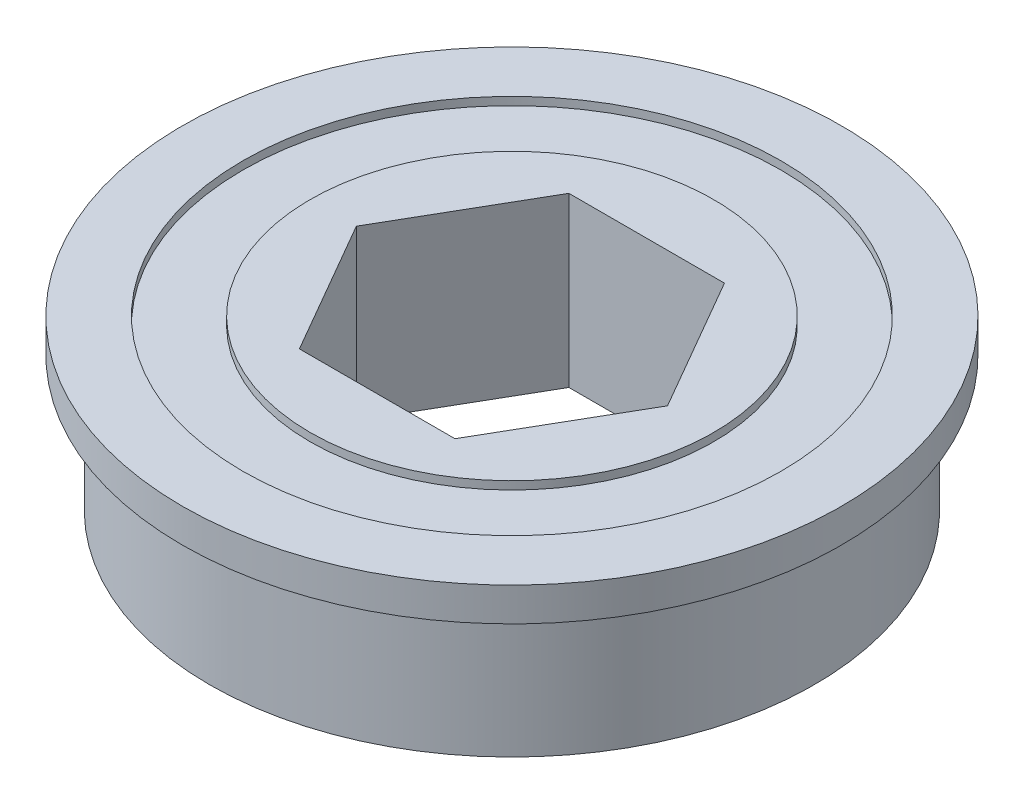
ISO-10303-21;
HEADER;
FILE_DESCRIPTION(('STEP AP214'),'2;1');
FILE_NAME('part.step','',(''),(''),'','','');
FILE_SCHEMA(('AUTOMOTIVE_DESIGN { 1 0 10303 214 1 1 1 1 }'));
ENDSEC;
DATA;
#1=APPLICATION_CONTEXT('core data for automotive mechanical design processes');
#2=APPLICATION_PROTOCOL_DEFINITION('international standard','automotive_design',2000,#1);
#3=PRODUCT_CONTEXT('',#1,'mechanical');
#4=PRODUCT('Part','Part','',(#3));
#5=PRODUCT_RELATED_PRODUCT_CATEGORY('part','',(#4));
#6=PRODUCT_DEFINITION_FORMATION('','',#4);
#7=PRODUCT_DEFINITION_CONTEXT('part definition',#1,'design');
#8=PRODUCT_DEFINITION('design','',#6,#7);
#9=PRODUCT_DEFINITION_SHAPE('','',#8);
#10=(LENGTH_UNIT() NAMED_UNIT(*) SI_UNIT(.MILLI.,.METRE.));
#11=(NAMED_UNIT(*) PLANE_ANGLE_UNIT() SI_UNIT($,.RADIAN.));
#12=(NAMED_UNIT(*) SI_UNIT($,.STERADIAN.) SOLID_ANGLE_UNIT());
#13=UNCERTAINTY_MEASURE_WITH_UNIT(LENGTH_MEASURE(1.E-05),#10,'distance_accuracy_value','');
#14=(GEOMETRIC_REPRESENTATION_CONTEXT(3) GLOBAL_UNCERTAINTY_ASSIGNED_CONTEXT((#13)) GLOBAL_UNIT_ASSIGNED_CONTEXT((#10,
#11,#12)) REPRESENTATION_CONTEXT('',''));
#15=CARTESIAN_POINT('',(0.,0.,0.));
#16=DIRECTION('',(0.,0.,1.));
#17=DIRECTION('',(1.,0.,0.));
#18=AXIS2_PLACEMENT_3D('',#15,#16,#17);
#19=CARTESIAN_POINT('',(14.2748,0.,0.));
#20=DIRECTION('',(0.,-1.,0.));
#21=DIRECTION('',(0.,0.,-1.));
#22=AXIS2_PLACEMENT_3D('',#19,#20,#21);
#23=PLANE('',#22);
#24=DIRECTION('',(1.,0.,0.));
#25=VECTOR('',#24,1.);
#26=CARTESIAN_POINT('',(14.2748,0.,6.36));
#27=LINE('',#26,#25);
#28=CARTESIAN_POINT('',(-3.67194771204601,0.,6.36));
#29=VERTEX_POINT('',#28);
#30=CARTESIAN_POINT('',(3.67194771204602,0.,6.36));
#31=VERTEX_POINT('',#30);
#32=EDGE_CURVE('E157',#29,#31,#27,.T.);
#33=ORIENTED_EDGE('',*,*,#32,.T.);
#34=DIRECTION('',(0.5,0.,-0.866025403784439));
#35=VECTOR('',#34,1.);
#36=CARTESIAN_POINT('',(3.67194771204602,0.,6.36));
#37=LINE('',#36,#35);
#38=CARTESIAN_POINT('',(7.34389542409204,0.,0.));
#39=VERTEX_POINT('',#38);
#40=EDGE_CURVE('E50',#31,#39,#37,.T.);
#41=ORIENTED_EDGE('',*,*,#40,.T.);
#42=DIRECTION('',(-0.5,0.,-0.866025403784438));
#43=VECTOR('',#42,1.);
#44=CARTESIAN_POINT('',(7.34389542409204,0.,0.));
#45=LINE('',#44,#43);
#46=CARTESIAN_POINT('',(3.67194771204602,0.,-6.36));
#47=VERTEX_POINT('',#46);
#48=EDGE_CURVE('E123',#39,#47,#45,.T.);
#49=ORIENTED_EDGE('',*,*,#48,.T.);
#50=DIRECTION('',(1.,0.,0.));
#51=VECTOR('',#50,1.);
#52=CARTESIAN_POINT('',(14.2748,0.,-6.36));
#53=LINE('',#52,#51);
#54=CARTESIAN_POINT('',(-3.67194771204602,0.,-6.36));
#55=VERTEX_POINT('',#54);
#56=EDGE_CURVE('E115',#47,#55,#53,.F.);
#57=ORIENTED_EDGE('',*,*,#56,.T.);
#58=DIRECTION('',(-0.5,0.,0.866025403784439));
#59=VECTOR('',#58,1.);
#60=CARTESIAN_POINT('',(-3.67194771204602,0.,-6.36));
#61=LINE('',#60,#59);
#62=CARTESIAN_POINT('',(-7.34389542409204,0.,0.));
#63=VERTEX_POINT('',#62);
#64=EDGE_CURVE('E163',#55,#63,#61,.T.);
#65=ORIENTED_EDGE('',*,*,#64,.T.);
#66=DIRECTION('',(0.5,0.,0.866025403784439));
#67=VECTOR('',#66,1.);
#68=CARTESIAN_POINT('',(-7.34389542409204,0.,0.));
#69=LINE('',#68,#67);
#70=EDGE_CURVE('E160',#63,#29,#69,.T.);
#71=ORIENTED_EDGE('',*,*,#70,.T.);
#72=EDGE_LOOP('',(#33,#41,#49,#57,#65,#71));
#73=FACE_BOUND('',#72,.T.);
#74=CARTESIAN_POINT('',(0.,0.,0.));
#75=DIRECTION('',(0.,-1.,0.));
#76=DIRECTION('',(0.,0.,-1.));
#77=AXIS2_PLACEMENT_3D('',#74,#75,#76);
#78=CIRCLE('',#77,9.525);
#79=CARTESIAN_POINT('',(0.,0.,-9.525));
#80=VERTEX_POINT('',#79);
#81=EDGE_CURVE('E152',#80,#80,#78,.T.);
#82=ORIENTED_EDGE('',*,*,#81,.T.);
#83=EDGE_LOOP('',(#82));
#84=FACE_BOUND('',#83,.T.);
#85=ADVANCED_FACE('F40',(#73,#84),#23,.T.);
#86=CARTESIAN_POINT('',(0.,0.,0.));
#87=DIRECTION('',(0.,1.,0.));
#88=DIRECTION('',(0.,0.,1.));
#89=AXIS2_PLACEMENT_3D('',#86,#87,#88);
#90=CYLINDRICAL_SURFACE('',#89,12.7);
#91=CARTESIAN_POINT('',(0.,7.9375,0.));
#92=DIRECTION('',(0.,1.,0.));
#93=DIRECTION('',(0.,0.,1.));
#94=AXIS2_PLACEMENT_3D('',#91,#92,#93);
#95=CIRCLE('',#94,12.7);
#96=CARTESIAN_POINT('',(0.,7.9375,12.7));
#97=VERTEX_POINT('',#96);
#98=EDGE_CURVE('E135',#97,#97,#95,.F.);
#99=ORIENTED_EDGE('',*,*,#98,.F.);
#100=EDGE_LOOP('',(#99));
#101=FACE_BOUND('',#100,.T.);
#102=CARTESIAN_POINT('',(0.,7.5565,0.));
#103=DIRECTION('',(0.,1.,0.));
#104=DIRECTION('',(0.,0.,1.));
#105=AXIS2_PLACEMENT_3D('',#102,#103,#104);
#106=CIRCLE('',#105,12.7);
#107=CARTESIAN_POINT('',(0.,7.5565,12.7));
#108=VERTEX_POINT('',#107);
#109=EDGE_CURVE('E44',#108,#108,#106,.T.);
#110=ORIENTED_EDGE('',*,*,#109,.F.);
#111=EDGE_LOOP('',(#110));
#112=FACE_BOUND('',#111,.T.);
#113=ADVANCED_FACE('F42',(#101,#112),#90,.F.);
#114=CARTESIAN_POINT('',(9.525,7.5565,0.));
#115=DIRECTION('',(0.,1.,0.));
#116=DIRECTION('',(0.,0.,1.));
#117=AXIS2_PLACEMENT_3D('',#114,#115,#116);
#118=PLANE('',#117);
#119=CARTESIAN_POINT('',(0.,7.5565,0.));
#120=DIRECTION('',(0.,1.,0.));
#121=DIRECTION('',(0.,0.,1.));
#122=AXIS2_PLACEMENT_3D('',#119,#120,#121);
#123=CIRCLE('',#122,9.525);
#124=CARTESIAN_POINT('',(0.,7.5565,9.525));
#125=VERTEX_POINT('',#124);
#126=EDGE_CURVE('E133',#125,#125,#123,.T.);
#127=ORIENTED_EDGE('',*,*,#126,.F.);
#128=EDGE_LOOP('',(#127));
#129=FACE_BOUND('',#128,.T.);
#130=ORIENTED_EDGE('',*,*,#109,.T.);
#131=EDGE_LOOP('',(#130));
#132=FACE_BOUND('',#131,.T.);
#133=ADVANCED_FACE('F207',(#129,#132),#118,.T.);
#134=CARTESIAN_POINT('',(12.7,7.9375,0.));
#135=DIRECTION('',(0.,1.,0.));
#136=DIRECTION('',(0.,0.,1.));
#137=AXIS2_PLACEMENT_3D('',#134,#135,#136);
#138=PLANE('',#137);
#139=ORIENTED_EDGE('',*,*,#98,.T.);
#140=EDGE_LOOP('',(#139));
#141=FACE_BOUND('',#140,.T.);
#142=CARTESIAN_POINT('',(0.,7.9375,0.));
#143=DIRECTION('',(0.,1.,0.));
#144=DIRECTION('',(0.,0.,1.));
#145=AXIS2_PLACEMENT_3D('',#142,#143,#144);
#146=CIRCLE('',#145,15.5575);
#147=CARTESIAN_POINT('',(0.,7.9375,15.5575));
#148=VERTEX_POINT('',#147);
#149=EDGE_CURVE('E130',#148,#148,#146,.F.);
#150=ORIENTED_EDGE('',*,*,#149,.F.);
#151=EDGE_LOOP('',(#150));
#152=FACE_BOUND('',#151,.T.);
#153=ADVANCED_FACE('F248',(#141,#152),#138,.T.);
#154=CARTESIAN_POINT('',(0.,0.,0.));
#155=DIRECTION('',(0.,1.,0.));
#156=DIRECTION('',(0.,0.,1.));
#157=AXIS2_PLACEMENT_3D('',#154,#155,#156);
#158=CYLINDRICAL_SURFACE('',#157,9.525);
#159=ORIENTED_EDGE('',*,*,#126,.T.);
#160=EDGE_LOOP('',(#159));
#161=FACE_BOUND('',#160,.T.);
#162=CARTESIAN_POINT('',(0.,7.9375,0.));
#163=DIRECTION('',(0.,1.,0.));
#164=DIRECTION('',(0.,0.,1.));
#165=AXIS2_PLACEMENT_3D('',#162,#163,#164);
#166=CIRCLE('',#165,9.525);
#167=CARTESIAN_POINT('',(0.,7.9375,9.525));
#168=VERTEX_POINT('',#167);
#169=EDGE_CURVE('E127',#168,#168,#166,.T.);
#170=ORIENTED_EDGE('',*,*,#169,.F.);
#171=EDGE_LOOP('',(#170));
#172=FACE_BOUND('',#171,.T.);
#173=ADVANCED_FACE('F244',(#161,#172),#158,.T.);
#174=CARTESIAN_POINT('',(0.,0.,0.));
#175=DIRECTION('',(0.,1.,0.));
#176=DIRECTION('',(0.,0.,1.));
#177=AXIS2_PLACEMENT_3D('',#174,#175,#176);
#178=CYLINDRICAL_SURFACE('',#177,15.5575);
#179=CARTESIAN_POINT('',(0.,6.35,0.));
#180=DIRECTION('',(0.,1.,0.));
#181=DIRECTION('',(0.,0.,1.));
#182=AXIS2_PLACEMENT_3D('',#179,#180,#181);
#183=CIRCLE('',#182,15.5575);
#184=CARTESIAN_POINT('',(0.,6.35,15.5575));
#185=VERTEX_POINT('',#184);
#186=EDGE_CURVE('E105',#185,#185,#183,.F.);
#187=ORIENTED_EDGE('',*,*,#186,.F.);
#188=EDGE_LOOP('',(#187));
#189=FACE_BOUND('',#188,.T.);
#190=ORIENTED_EDGE('',*,*,#149,.T.);
#191=EDGE_LOOP('',(#190));
#192=FACE_BOUND('',#191,.T.);
#193=ADVANCED_FACE('F237',(#189,#192),#178,.T.);
#194=CARTESIAN_POINT('',(6.35,7.9375,0.));
#195=DIRECTION('',(0.,1.,0.));
#196=DIRECTION('',(0.,0.,1.));
#197=AXIS2_PLACEMENT_3D('',#194,#195,#196);
#198=PLANE('',#197);
#199=ORIENTED_EDGE('',*,*,#169,.T.);
#200=EDGE_LOOP('',(#199));
#201=FACE_BOUND('',#200,.T.);
#202=DIRECTION('',(-0.5,0.,0.866025403784439));
#203=VECTOR('',#202,1.);
#204=CARTESIAN_POINT('',(-3.67194771204602,7.9375,-6.36));
#205=LINE('',#204,#203);
#206=CARTESIAN_POINT('',(-7.34389542409204,7.9375,0.));
#207=VERTEX_POINT('',#206);
#208=CARTESIAN_POINT('',(-3.67194771204602,7.9375,-6.36));
#209=VERTEX_POINT('',#208);
#210=EDGE_CURVE('E109',#207,#209,#205,.F.);
#211=ORIENTED_EDGE('',*,*,#210,.T.);
#212=DIRECTION('',(-1.,0.,0.));
#213=VECTOR('',#212,1.);
#214=CARTESIAN_POINT('',(3.67194771204602,7.9375,-6.36));
#215=LINE('',#214,#213);
#216=CARTESIAN_POINT('',(3.67194771204602,7.9375,-6.36));
#217=VERTEX_POINT('',#216);
#218=EDGE_CURVE('E91',#209,#217,#215,.F.);
#219=ORIENTED_EDGE('',*,*,#218,.T.);
#220=DIRECTION('',(-0.5,0.,-0.866025403784439));
#221=VECTOR('',#220,1.);
#222=CARTESIAN_POINT('',(7.34389542409204,7.9375,0.));
#223=LINE('',#222,#221);
#224=CARTESIAN_POINT('',(7.34389542409204,7.9375,0.));
#225=VERTEX_POINT('',#224);
#226=EDGE_CURVE('E96',#217,#225,#223,.F.);
#227=ORIENTED_EDGE('',*,*,#226,.T.);
#228=DIRECTION('',(0.5,0.,-0.866025403784439));
#229=VECTOR('',#228,1.);
#230=CARTESIAN_POINT('',(3.67194771204602,7.9375,6.36));
#231=LINE('',#230,#229);
#232=CARTESIAN_POINT('',(3.67194771204602,7.9375,6.36));
#233=VERTEX_POINT('',#232);
#234=EDGE_CURVE('E124',#225,#233,#231,.F.);
#235=ORIENTED_EDGE('',*,*,#234,.T.);
#236=DIRECTION('',(1.,0.,0.));
#237=VECTOR('',#236,1.);
#238=CARTESIAN_POINT('',(-3.67194771204601,7.9375,6.36));
#239=LINE('',#238,#237);
#240=CARTESIAN_POINT('',(-3.67194771204601,7.9375,6.36));
#241=VERTEX_POINT('',#240);
#242=EDGE_CURVE('E171',#233,#241,#239,.F.);
#243=ORIENTED_EDGE('',*,*,#242,.T.);
#244=DIRECTION('',(0.5,0.,0.866025403784439));
#245=VECTOR('',#244,1.);
#246=CARTESIAN_POINT('',(-7.34389542409204,7.9375,0.));
#247=LINE('',#246,#245);
#248=EDGE_CURVE('E176',#241,#207,#247,.F.);
#249=ORIENTED_EDGE('',*,*,#248,.T.);
#250=EDGE_LOOP('',(#211,#219,#227,#235,#243,#249));
#251=FACE_BOUND('',#250,.T.);
#252=ADVANCED_FACE('F107',(#201,#251),#198,.T.);
#253=CARTESIAN_POINT('',(15.5575,6.35,0.));
#254=DIRECTION('',(0.,-1.,0.));
#255=DIRECTION('',(0.,0.,-1.));
#256=AXIS2_PLACEMENT_3D('',#253,#254,#255);
#257=PLANE('',#256);
#258=ORIENTED_EDGE('',*,*,#186,.T.);
#259=EDGE_LOOP('',(#258));
#260=FACE_BOUND('',#259,.T.);
#261=CARTESIAN_POINT('',(0.,6.35,0.));
#262=DIRECTION('',(0.,1.,0.));
#263=DIRECTION('',(0.,0.,1.));
#264=AXIS2_PLACEMENT_3D('',#261,#262,#263);
#265=CIRCLE('',#264,14.2748);
#266=CARTESIAN_POINT('',(0.,6.35,14.2748));
#267=VERTEX_POINT('',#266);
#268=EDGE_CURVE('E120',#267,#267,#265,.F.);
#269=ORIENTED_EDGE('',*,*,#268,.F.);
#270=EDGE_LOOP('',(#269));
#271=FACE_BOUND('',#270,.T.);
#272=ADVANCED_FACE('F228',(#260,#271),#257,.T.);
#273=CARTESIAN_POINT('',(7.34389542409204,0.,0.));
#274=DIRECTION('',(0.866025403784439,0.,-0.5));
#275=DIRECTION('',(-0.5,0.,-0.866025403784439));
#276=AXIS2_PLACEMENT_3D('',#273,#274,#275);
#277=PLANE('',#276);
#278=DIRECTION('',(0.,1.,0.));
#279=VECTOR('',#278,1.);
#280=CARTESIAN_POINT('',(3.67194771204602,0.,-6.36));
#281=LINE('',#280,#279);
#282=EDGE_CURVE('E98',#217,#47,#281,.F.);
#283=ORIENTED_EDGE('',*,*,#282,.T.);
#284=ORIENTED_EDGE('',*,*,#48,.F.);
#285=DIRECTION('',(0.,1.,0.));
#286=VECTOR('',#285,1.);
#287=CARTESIAN_POINT('',(7.34389542409204,0.,0.));
#288=LINE('',#287,#286);
#289=EDGE_CURVE('E101',#39,#225,#288,.T.);
#290=ORIENTED_EDGE('',*,*,#289,.T.);
#291=ORIENTED_EDGE('',*,*,#226,.F.);
#292=EDGE_LOOP('',(#283,#284,#290,#291));
#293=FACE_BOUND('',#292,.T.);
#294=ADVANCED_FACE('F97',(#293),#277,.F.);
#295=CARTESIAN_POINT('',(3.67194771204602,0.,-6.36));
#296=DIRECTION('',(0.,0.,-1.));
#297=DIRECTION('',(-1.,0.,0.));
#298=AXIS2_PLACEMENT_3D('',#295,#296,#297);
#299=PLANE('',#298);
#300=DIRECTION('',(0.,1.,0.));
#301=VECTOR('',#300,1.);
#302=CARTESIAN_POINT('',(-3.67194771204602,0.,-6.36));
#303=LINE('',#302,#301);
#304=EDGE_CURVE('E111',#209,#55,#303,.F.);
#305=ORIENTED_EDGE('',*,*,#304,.T.);
#306=ORIENTED_EDGE('',*,*,#56,.F.);
#307=ORIENTED_EDGE('',*,*,#282,.F.);
#308=ORIENTED_EDGE('',*,*,#218,.F.);
#309=EDGE_LOOP('',(#305,#306,#307,#308));
#310=FACE_BOUND('',#309,.T.);
#311=ADVANCED_FACE('F113',(#310),#299,.F.);
#312=CARTESIAN_POINT('',(-3.67194771204602,0.,-6.36));
#313=DIRECTION('',(-0.866025403784439,0.,-0.5));
#314=DIRECTION('',(-0.5,0.,0.866025403784439));
#315=AXIS2_PLACEMENT_3D('',#312,#313,#314);
#316=PLANE('',#315);
#317=DIRECTION('',(0.,1.,0.));
#318=VECTOR('',#317,1.);
#319=CARTESIAN_POINT('',(-7.34389542409204,0.,0.));
#320=LINE('',#319,#318);
#321=EDGE_CURVE('E178',#207,#63,#320,.F.);
#322=ORIENTED_EDGE('',*,*,#321,.T.);
#323=ORIENTED_EDGE('',*,*,#64,.F.);
#324=ORIENTED_EDGE('',*,*,#304,.F.);
#325=ORIENTED_EDGE('',*,*,#210,.F.);
#326=EDGE_LOOP('',(#322,#323,#324,#325));
#327=FACE_BOUND('',#326,.T.);
#328=ADVANCED_FACE('F182',(#327),#316,.F.);
#329=CARTESIAN_POINT('',(-7.34389542409204,0.,0.));
#330=DIRECTION('',(-0.866025403784439,0.,0.5));
#331=DIRECTION('',(0.5,0.,0.866025403784439));
#332=AXIS2_PLACEMENT_3D('',#329,#330,#331);
#333=PLANE('',#332);
#334=DIRECTION('',(0.,1.,0.));
#335=VECTOR('',#334,1.);
#336=CARTESIAN_POINT('',(-3.67194771204601,0.,6.36));
#337=LINE('',#336,#335);
#338=EDGE_CURVE('E174',#241,#29,#337,.F.);
#339=ORIENTED_EDGE('',*,*,#338,.T.);
#340=ORIENTED_EDGE('',*,*,#70,.F.);
#341=ORIENTED_EDGE('',*,*,#321,.F.);
#342=ORIENTED_EDGE('',*,*,#248,.F.);
#343=EDGE_LOOP('',(#339,#340,#341,#342));
#344=FACE_BOUND('',#343,.T.);
#345=ADVANCED_FACE('F192',(#344),#333,.F.);
#346=CARTESIAN_POINT('',(-3.67194771204601,0.,6.36));
#347=DIRECTION('',(0.,0.,1.));
#348=DIRECTION('',(1.,0.,0.));
#349=AXIS2_PLACEMENT_3D('',#346,#347,#348);
#350=PLANE('',#349);
#351=DIRECTION('',(0.,1.,0.));
#352=VECTOR('',#351,1.);
#353=CARTESIAN_POINT('',(3.67194771204602,0.,6.36));
#354=LINE('',#353,#352);
#355=EDGE_CURVE('E59',#233,#31,#354,.F.);
#356=ORIENTED_EDGE('',*,*,#355,.T.);
#357=ORIENTED_EDGE('',*,*,#32,.F.);
#358=ORIENTED_EDGE('',*,*,#338,.F.);
#359=ORIENTED_EDGE('',*,*,#242,.F.);
#360=EDGE_LOOP('',(#356,#357,#358,#359));
#361=FACE_BOUND('',#360,.T.);
#362=ADVANCED_FACE('F190',(#361),#350,.F.);
#363=CARTESIAN_POINT('',(3.67194771204602,0.,6.36));
#364=DIRECTION('',(0.866025403784439,0.,0.5));
#365=DIRECTION('',(0.5,0.,-0.866025403784439));
#366=AXIS2_PLACEMENT_3D('',#363,#364,#365);
#367=PLANE('',#366);
#368=ORIENTED_EDGE('',*,*,#289,.F.);
#369=ORIENTED_EDGE('',*,*,#40,.F.);
#370=ORIENTED_EDGE('',*,*,#355,.F.);
#371=ORIENTED_EDGE('',*,*,#234,.F.);
#372=EDGE_LOOP('',(#368,#369,#370,#371));
#373=FACE_BOUND('',#372,.T.);
#374=ADVANCED_FACE('F188',(#373),#367,.F.);
#375=CARTESIAN_POINT('',(0.,0.,0.));
#376=DIRECTION('',(0.,1.,0.));
#377=DIRECTION('',(0.,0.,1.));
#378=AXIS2_PLACEMENT_3D('',#375,#376,#377);
#379=CYLINDRICAL_SURFACE('',#378,14.2748);
#380=CARTESIAN_POINT('',(0.,0.,0.));
#381=DIRECTION('',(0.,1.,0.));
#382=DIRECTION('',(0.,0.,1.));
#383=AXIS2_PLACEMENT_3D('',#380,#381,#382);
#384=CIRCLE('',#383,14.2748);
#385=CARTESIAN_POINT('',(0.,0.,14.2748));
#386=VERTEX_POINT('',#385);
#387=EDGE_CURVE('E11',#386,#386,#384,.F.);
#388=ORIENTED_EDGE('',*,*,#387,.F.);
#389=EDGE_LOOP('',(#388));
#390=FACE_BOUND('',#389,.T.);
#391=ORIENTED_EDGE('',*,*,#268,.T.);
#392=EDGE_LOOP('',(#391));
#393=FACE_BOUND('',#392,.T.);
#394=ADVANCED_FACE('F213',(#390,#393),#379,.T.);
#395=CARTESIAN_POINT('',(0.,0.,0.));
#396=DIRECTION('',(0.,-1.,0.));
#397=DIRECTION('',(0.,0.,-1.));
#398=AXIS2_PLACEMENT_3D('',#395,#396,#397);
#399=CIRCLE('',#398,12.7);
#400=CARTESIAN_POINT('',(0.,0.,-12.7));
#401=VERTEX_POINT('',#400);
#402=EDGE_CURVE('E144',#401,#401,#399,.T.);
#403=ORIENTED_EDGE('',*,*,#402,.F.);
#404=EDGE_LOOP('',(#403));
#405=FACE_BOUND('',#404,.T.);
#406=ORIENTED_EDGE('',*,*,#387,.T.);
#407=EDGE_LOOP('',(#406));
#408=FACE_BOUND('',#407,.T.);
#409=ADVANCED_FACE('F203',(#405,#408),#23,.T.);
#410=CARTESIAN_POINT('',(0.,0.381,0.));
#411=DIRECTION('',(0.,-1.,0.));
#412=DIRECTION('',(0.,0.,-1.));
#413=AXIS2_PLACEMENT_3D('',#410,#411,#412);
#414=CYLINDRICAL_SURFACE('',#413,12.7);
#415=CARTESIAN_POINT('',(0.,0.381,0.));
#416=DIRECTION('',(0.,-1.,0.));
#417=DIRECTION('',(0.,0.,-1.));
#418=AXIS2_PLACEMENT_3D('',#415,#416,#417);
#419=CIRCLE('',#418,12.7);
#420=CARTESIAN_POINT('',(0.,0.381,-12.7));
#421=VERTEX_POINT('',#420);
#422=EDGE_CURVE('E140',#421,#421,#419,.T.);
#423=CARTESIAN_POINT('',(0.,0.381,-12.7));
#424=CARTESIAN_POINT('',(0.,0.37703125,-12.7));
#425=CARTESIAN_POINT('',(0.,0.3730625,-12.7));
#426=CARTESIAN_POINT('',(0.,0.365125,-12.7));
#427=CARTESIAN_POINT('',(0.,0.36115625,-12.7));
#428=CARTESIAN_POINT('',(0.,0.35321875,-12.7));
#429=CARTESIAN_POINT('',(0.,0.34925,-12.7));
#430=CARTESIAN_POINT('',(0.,0.3413125,-12.7));
#431=CARTESIAN_POINT('',(0.,0.33734375,-12.7));
#432=CARTESIAN_POINT('',(0.,0.32940625,-12.7));
#433=CARTESIAN_POINT('',(0.,0.3254375,-12.7));
#434=CARTESIAN_POINT('',(0.,0.3175,-12.7));
#435=CARTESIAN_POINT('',(0.,0.31353125,-12.7));
#436=CARTESIAN_POINT('',(0.,0.30559375,-12.7));
#437=CARTESIAN_POINT('',(0.,0.301625,-12.7));
#438=CARTESIAN_POINT('',(0.,0.2936875,-12.7));
#439=CARTESIAN_POINT('',(0.,0.28971875,-12.7));
#440=CARTESIAN_POINT('',(0.,0.28178125,-12.7));
#441=CARTESIAN_POINT('',(0.,0.2778125,-12.7));
#442=CARTESIAN_POINT('',(0.,0.269875,-12.7));
#443=CARTESIAN_POINT('',(0.,0.26590625,-12.7));
#444=CARTESIAN_POINT('',(0.,0.25796875,-12.7));
#445=CARTESIAN_POINT('',(0.,0.254,-12.7));
#446=CARTESIAN_POINT('',(0.,0.2460625,-12.7));
#447=CARTESIAN_POINT('',(0.,0.24209375,-12.7));
#448=CARTESIAN_POINT('',(0.,0.23415625,-12.7));
#449=CARTESIAN_POINT('',(0.,0.2301875,-12.7));
#450=CARTESIAN_POINT('',(0.,0.22225,-12.7));
#451=CARTESIAN_POINT('',(0.,0.21828125,-12.7));
#452=CARTESIAN_POINT('',(0.,0.21034375,-12.7));
#453=CARTESIAN_POINT('',(0.,0.206375,-12.7));
#454=CARTESIAN_POINT('',(0.,0.1984375,-12.7));
#455=CARTESIAN_POINT('',(0.,0.19446875,-12.7));
#456=CARTESIAN_POINT('',(0.,0.18653125,-12.7));
#457=CARTESIAN_POINT('',(0.,0.1825625,-12.7));
#458=CARTESIAN_POINT('',(0.,0.174625,-12.7));
#459=CARTESIAN_POINT('',(0.,0.17065625,-12.7));
#460=CARTESIAN_POINT('',(0.,0.16271875,-12.7));
#461=CARTESIAN_POINT('',(0.,0.15875,-12.7));
#462=CARTESIAN_POINT('',(0.,0.1508125,-12.7));
#463=CARTESIAN_POINT('',(0.,0.14684375,-12.7));
#464=CARTESIAN_POINT('',(0.,0.13890625,-12.7));
#465=CARTESIAN_POINT('',(0.,0.1349375,-12.7));
#466=CARTESIAN_POINT('',(0.,0.127,-12.7));
#467=CARTESIAN_POINT('',(0.,0.12303125,-12.7));
#468=CARTESIAN_POINT('',(0.,0.11509375,-12.7));
#469=CARTESIAN_POINT('',(0.,0.111125,-12.7));
#470=CARTESIAN_POINT('',(0.,0.1031875,-12.7));
#471=CARTESIAN_POINT('',(0.,0.09921875,-12.7));
#472=CARTESIAN_POINT('',(0.,0.09128125,-12.7));
#473=CARTESIAN_POINT('',(0.,0.0873125,-12.7));
#474=CARTESIAN_POINT('',(0.,0.079375,-12.7));
#475=CARTESIAN_POINT('',(0.,0.07540625,-12.7));
#476=CARTESIAN_POINT('',(0.,0.06746875,-12.7));
#477=CARTESIAN_POINT('',(0.,0.0635,-12.7));
#478=CARTESIAN_POINT('',(0.,0.0555625,-12.7));
#479=CARTESIAN_POINT('',(0.,0.05159375,-12.7));
#480=CARTESIAN_POINT('',(0.,0.04365625,-12.7));
#481=CARTESIAN_POINT('',(0.,0.0396875,-12.7));
#482=CARTESIAN_POINT('',(0.,0.03175,-12.7));
#483=CARTESIAN_POINT('',(0.,0.02778125,-12.7));
#484=CARTESIAN_POINT('',(0.,0.01984375,-12.7));
#485=CARTESIAN_POINT('',(0.,0.015875,-12.7));
#486=CARTESIAN_POINT('',(0.,0.00793749999999999,-12.7));
#487=CARTESIAN_POINT('',(0.,0.00396874999999999,-12.7));
#488=CARTESIAN_POINT('',(0.,0.,-12.7));
#489=B_SPLINE_CURVE_WITH_KNOTS('',3,(#423,#424,#425,#426,#427,#428,#429,#430,#431,#432,#433,
#434,#435,#436,#437,#438,#439,#440,#441,#442,#443,#444,#445,#446,#447,#448,#449,#450,#451,#452,
#453,#454,#455,#456,#457,#458,#459,#460,#461,#462,#463,#464,#465,#466,#467,#468,#469,#470,#471,
#472,#473,#474,#475,#476,#477,#478,#479,#480,#481,#482,#483,#484,#485,#486,#487,#488),
.UNSPECIFIED.,.F.,.F.,(4,2,2,2,2,2,2,2,2,2,2,2,2,2,2,2,2,2,2,2,2,2,2,2,2,2,2,2,2,2,2,2,4),(0.,
0.01190625,0.0238125,0.03571875,0.047625,0.05953125,0.0714375,0.08334375,0.0952500000000001,
0.10715625,0.1190625,0.13096875,0.142875,0.15478125,0.1666875,0.17859375,0.1905,0.20240625,
0.2143125,0.22621875,0.238125,0.25003125,0.2619375,0.27384375,0.28575,0.29765625,0.3095625,
0.32146875,0.333375,0.34528125,0.3571875,0.36909375,0.381),.UNSPECIFIED.);
#490=EDGE_CURVE('BSEAM209',#421,#401,#489,.T.);
#491=ORIENTED_EDGE('',*,*,#422,.F.);
#492=ORIENTED_EDGE('',*,*,#402,.T.);
#493=ORIENTED_EDGE('',*,*,#490,.T.);
#494=ORIENTED_EDGE('',*,*,#490,.F.);
#495=EDGE_LOOP('',(#491,#493,#492,#494));
#496=FACE_BOUND('',#495,.T.);
#497=ADVANCED_FACE('F209',(#496),#414,.F.);
#498=CARTESIAN_POINT('',(0.,0.381,0.));
#499=DIRECTION('',(0.,-1.,0.));
#500=DIRECTION('',(0.,0.,-1.));
#501=AXIS2_PLACEMENT_3D('',#498,#499,#500);
#502=PLANE('',#501);
#503=CARTESIAN_POINT('',(0.,0.381,0.));
#504=DIRECTION('',(0.,-1.,0.));
#505=DIRECTION('',(0.,0.,-1.));
#506=AXIS2_PLACEMENT_3D('',#503,#504,#505);
#507=CIRCLE('',#506,9.525);
#508=CARTESIAN_POINT('',(0.,0.381,-9.525));
#509=VERTEX_POINT('',#508);
#510=EDGE_CURVE('E149',#509,#509,#507,.T.);
#511=ORIENTED_EDGE('',*,*,#510,.F.);
#512=EDGE_LOOP('',(#511));
#513=FACE_BOUND('',#512,.T.);
#514=ORIENTED_EDGE('',*,*,#422,.T.);
#515=EDGE_LOOP('',(#514));
#516=FACE_BOUND('',#515,.T.);
#517=ADVANCED_FACE('F219',(#513,#516),#502,.T.);
#518=CARTESIAN_POINT('',(0.,0.381,0.));
#519=DIRECTION('',(0.,-1.,0.));
#520=DIRECTION('',(0.,0.,-1.));
#521=AXIS2_PLACEMENT_3D('',#518,#519,#520);
#522=CYLINDRICAL_SURFACE('',#521,9.525);
#523=CARTESIAN_POINT('',(0.,0.381,-9.525));
#524=CARTESIAN_POINT('',(0.,0.37703125,-9.525));
#525=CARTESIAN_POINT('',(0.,0.3730625,-9.525));
#526=CARTESIAN_POINT('',(0.,0.365125,-9.525));
#527=CARTESIAN_POINT('',(0.,0.36115625,-9.525));
#528=CARTESIAN_POINT('',(0.,0.35321875,-9.525));
#529=CARTESIAN_POINT('',(0.,0.34925,-9.525));
#530=CARTESIAN_POINT('',(0.,0.3413125,-9.525));
#531=CARTESIAN_POINT('',(0.,0.33734375,-9.525));
#532=CARTESIAN_POINT('',(0.,0.32940625,-9.525));
#533=CARTESIAN_POINT('',(0.,0.3254375,-9.525));
#534=CARTESIAN_POINT('',(0.,0.3175,-9.525));
#535=CARTESIAN_POINT('',(0.,0.31353125,-9.525));
#536=CARTESIAN_POINT('',(0.,0.30559375,-9.525));
#537=CARTESIAN_POINT('',(0.,0.301625,-9.525));
#538=CARTESIAN_POINT('',(0.,0.2936875,-9.525));
#539=CARTESIAN_POINT('',(0.,0.28971875,-9.525));
#540=CARTESIAN_POINT('',(0.,0.28178125,-9.525));
#541=CARTESIAN_POINT('',(0.,0.2778125,-9.525));
#542=CARTESIAN_POINT('',(0.,0.269875,-9.525));
#543=CARTESIAN_POINT('',(0.,0.26590625,-9.525));
#544=CARTESIAN_POINT('',(0.,0.25796875,-9.525));
#545=CARTESIAN_POINT('',(0.,0.254,-9.525));
#546=CARTESIAN_POINT('',(0.,0.2460625,-9.525));
#547=CARTESIAN_POINT('',(0.,0.24209375,-9.525));
#548=CARTESIAN_POINT('',(0.,0.23415625,-9.525));
#549=CARTESIAN_POINT('',(0.,0.2301875,-9.525));
#550=CARTESIAN_POINT('',(0.,0.22225,-9.525));
#551=CARTESIAN_POINT('',(0.,0.21828125,-9.525));
#552=CARTESIAN_POINT('',(0.,0.21034375,-9.525));
#553=CARTESIAN_POINT('',(0.,0.206375,-9.525));
#554=CARTESIAN_POINT('',(0.,0.1984375,-9.525));
#555=CARTESIAN_POINT('',(0.,0.19446875,-9.525));
#556=CARTESIAN_POINT('',(0.,0.18653125,-9.525));
#557=CARTESIAN_POINT('',(0.,0.1825625,-9.525));
#558=CARTESIAN_POINT('',(0.,0.174625,-9.525));
#559=CARTESIAN_POINT('',(0.,0.17065625,-9.525));
#560=CARTESIAN_POINT('',(0.,0.16271875,-9.525));
#561=CARTESIAN_POINT('',(0.,0.15875,-9.525));
#562=CARTESIAN_POINT('',(0.,0.1508125,-9.525));
#563=CARTESIAN_POINT('',(0.,0.14684375,-9.525));
#564=CARTESIAN_POINT('',(0.,0.13890625,-9.525));
#565=CARTESIAN_POINT('',(0.,0.1349375,-9.525));
#566=CARTESIAN_POINT('',(0.,0.127,-9.525));
#567=CARTESIAN_POINT('',(0.,0.12303125,-9.525));
#568=CARTESIAN_POINT('',(0.,0.11509375,-9.525));
#569=CARTESIAN_POINT('',(0.,0.111125,-9.525));
#570=CARTESIAN_POINT('',(0.,0.1031875,-9.525));
#571=CARTESIAN_POINT('',(0.,0.09921875,-9.525));
#572=CARTESIAN_POINT('',(0.,0.09128125,-9.525));
#573=CARTESIAN_POINT('',(0.,0.0873125,-9.525));
#574=CARTESIAN_POINT('',(0.,0.079375,-9.525));
#575=CARTESIAN_POINT('',(0.,0.07540625,-9.525));
#576=CARTESIAN_POINT('',(0.,0.06746875,-9.525));
#577=CARTESIAN_POINT('',(0.,0.0635,-9.525));
#578=CARTESIAN_POINT('',(0.,0.0555625,-9.525));
#579=CARTESIAN_POINT('',(0.,0.05159375,-9.525));
#580=CARTESIAN_POINT('',(0.,0.04365625,-9.525));
#581=CARTESIAN_POINT('',(0.,0.0396875,-9.525));
#582=CARTESIAN_POINT('',(0.,0.03175,-9.525));
#583=CARTESIAN_POINT('',(0.,0.02778125,-9.525));
#584=CARTESIAN_POINT('',(0.,0.01984375,-9.525));
#585=CARTESIAN_POINT('',(0.,0.015875,-9.525));
#586=CARTESIAN_POINT('',(0.,0.00793749999999999,-9.525));
#587=CARTESIAN_POINT('',(0.,0.00396874999999999,-9.525));
#588=CARTESIAN_POINT('',(0.,0.,-9.525));
#589=B_SPLINE_CURVE_WITH_KNOTS('',3,(#523,#524,#525,#526,#527,#528,#529,#530,#531,#532,#533,
#534,#535,#536,#537,#538,#539,#540,#541,#542,#543,#544,#545,#546,#547,#548,#549,#550,#551,#552,
#553,#554,#555,#556,#557,#558,#559,#560,#561,#562,#563,#564,#565,#566,#567,#568,#569,#570,#571,
#572,#573,#574,#575,#576,#577,#578,#579,#580,#581,#582,#583,#584,#585,#586,#587,#588),
.UNSPECIFIED.,.F.,.F.,(4,2,2,2,2,2,2,2,2,2,2,2,2,2,2,2,2,2,2,2,2,2,2,2,2,2,2,2,2,2,2,2,4),(0.,
0.01190625,0.0238125,0.03571875,0.047625,0.05953125,0.0714375,0.08334375,0.0952500000000001,
0.10715625,0.1190625,0.13096875,0.142875,0.15478125,0.1666875,0.17859375,0.1905,0.20240625,
0.2143125,0.22621875,0.238125,0.25003125,0.2619375,0.27384375,0.28575,0.29765625,0.3095625,
0.32146875,0.333375,0.34528125,0.3571875,0.36909375,0.381),.UNSPECIFIED.);
#590=EDGE_CURVE('BSEAM375',#509,#80,#589,.T.);
#591=ORIENTED_EDGE('',*,*,#510,.T.);
#592=ORIENTED_EDGE('',*,*,#81,.F.);
#593=ORIENTED_EDGE('',*,*,#590,.T.);
#594=ORIENTED_EDGE('',*,*,#590,.F.);
#595=EDGE_LOOP('',(#591,#593,#592,#594));
#596=FACE_BOUND('',#595,.T.);
#597=ADVANCED_FACE('F375',(#596),#522,.T.);
#598=CLOSED_SHELL('',(#85,#113,#133,#153,#173,#193,#252,#272,#294,#311,#328,#345,#362,#374,#394,
#409,#497,#517,#597));
#599=MANIFOLD_SOLID_BREP('B2',#598);
#600=ADVANCED_BREP_SHAPE_REPRESENTATION('',(#18,#599),#14);
#601=SHAPE_DEFINITION_REPRESENTATION(#9,#600);
ENDSEC;
END-ISO-10303-21;
